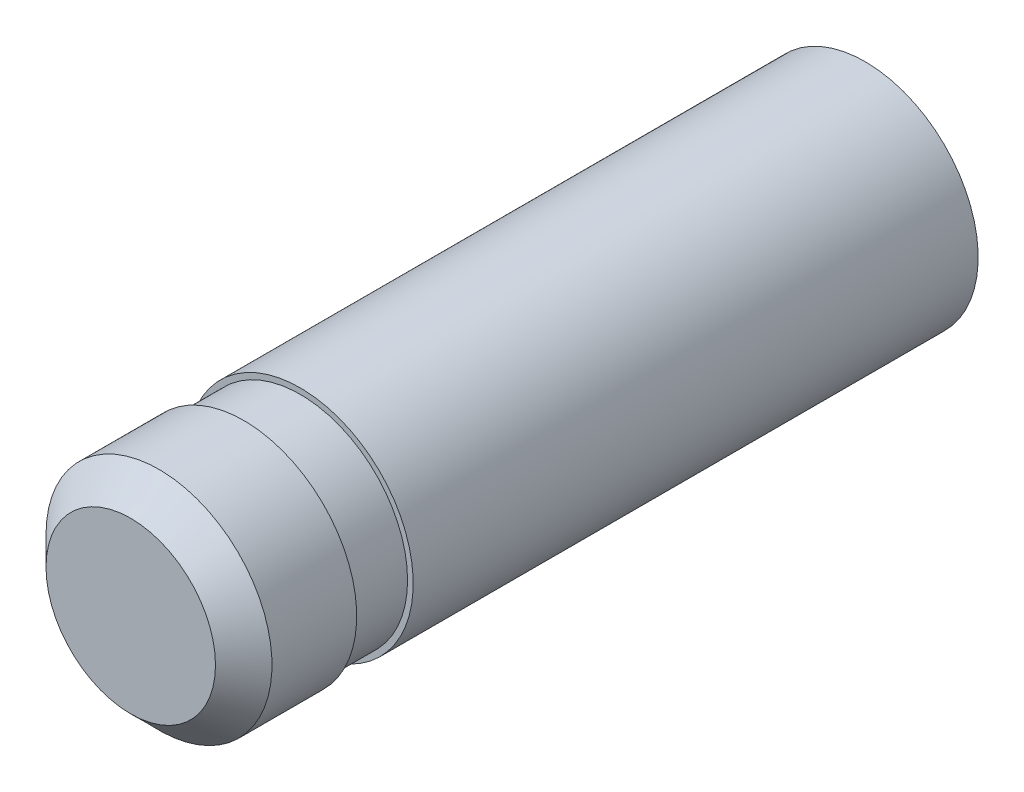
ISO-10303-21;
HEADER;
FILE_DESCRIPTION(('STEP AP214'),'2;1');
FILE_NAME('part.step','',(''),(''),'','','');
FILE_SCHEMA(('AUTOMOTIVE_DESIGN { 1 0 10303 214 1 1 1 1 }'));
ENDSEC;
DATA;
#1=APPLICATION_CONTEXT('core data for automotive mechanical design processes');
#2=APPLICATION_PROTOCOL_DEFINITION('international standard','automotive_design',2000,#1);
#3=PRODUCT_CONTEXT('',#1,'mechanical');
#4=PRODUCT('Part','Part','',(#3));
#5=PRODUCT_RELATED_PRODUCT_CATEGORY('part','',(#4));
#6=PRODUCT_DEFINITION_FORMATION('','',#4);
#7=PRODUCT_DEFINITION_CONTEXT('part definition',#1,'design');
#8=PRODUCT_DEFINITION('design','',#6,#7);
#9=PRODUCT_DEFINITION_SHAPE('','',#8);
#10=(LENGTH_UNIT() NAMED_UNIT(*) SI_UNIT(.MILLI.,.METRE.));
#11=(NAMED_UNIT(*) PLANE_ANGLE_UNIT() SI_UNIT($,.RADIAN.));
#12=(NAMED_UNIT(*) SI_UNIT($,.STERADIAN.) SOLID_ANGLE_UNIT());
#13=UNCERTAINTY_MEASURE_WITH_UNIT(LENGTH_MEASURE(1.E-05),#10,'distance_accuracy_value','');
#14=(GEOMETRIC_REPRESENTATION_CONTEXT(3) GLOBAL_UNCERTAINTY_ASSIGNED_CONTEXT((#13)) GLOBAL_UNIT_ASSIGNED_CONTEXT((#10,
#11,#12)) REPRESENTATION_CONTEXT('',''));
#15=CARTESIAN_POINT('',(0.,0.,0.));
#16=DIRECTION('',(0.,0.,1.));
#17=DIRECTION('',(1.,0.,0.));
#18=AXIS2_PLACEMENT_3D('',#15,#16,#17);
#19=CARTESIAN_POINT('',(0.,0.,6.5));
#20=DIRECTION('',(0.,0.,-1.));
#21=DIRECTION('',(-1.,0.,0.));
#22=AXIS2_PLACEMENT_3D('',#19,#20,#21);
#23=CYLINDRICAL_SURFACE('',#22,2.);
#24=CARTESIAN_POINT('',(0.,0.,-6.5));
#25=DIRECTION('',(0.,0.,1.));
#26=DIRECTION('',(1.,0.,0.));
#27=AXIS2_PLACEMENT_3D('',#24,#25,#26);
#28=CIRCLE('',#27,2.);
#29=CARTESIAN_POINT('',(-2.,0.,-6.5));
#30=VERTEX_POINT('',#29);
#31=EDGE_CURVE('E53',#30,#30,#28,.T.);
#32=CARTESIAN_POINT('',(0.,0.,3.5));
#33=DIRECTION('',(0.,0.,1.));
#34=DIRECTION('',(1.,0.,0.));
#35=AXIS2_PLACEMENT_3D('',#32,#33,#34);
#36=CIRCLE('',#35,2.);
#37=CARTESIAN_POINT('',(-2.,0.,3.5));
#38=VERTEX_POINT('',#37);
#39=EDGE_CURVE('E57',#38,#38,#36,.T.);
#40=CARTESIAN_POINT('',(-2.,0.,-6.5));
#41=CARTESIAN_POINT('',(-2.,0.,-6.39583333333333));
#42=CARTESIAN_POINT('',(-2.,0.,-6.29166666666667));
#43=CARTESIAN_POINT('',(-2.,0.,-6.08333333333333));
#44=CARTESIAN_POINT('',(-2.,0.,-5.97916666666667));
#45=CARTESIAN_POINT('',(-2.,0.,-5.77083333333333));
#46=CARTESIAN_POINT('',(-2.,0.,-5.66666666666667));
#47=CARTESIAN_POINT('',(-2.,0.,-5.45833333333333));
#48=CARTESIAN_POINT('',(-2.,0.,-5.35416666666667));
#49=CARTESIAN_POINT('',(-2.,0.,-5.14583333333333));
#50=CARTESIAN_POINT('',(-2.,0.,-5.04166666666667));
#51=CARTESIAN_POINT('',(-2.,0.,-4.83333333333333));
#52=CARTESIAN_POINT('',(-2.,0.,-4.72916666666667));
#53=CARTESIAN_POINT('',(-2.,0.,-4.52083333333333));
#54=CARTESIAN_POINT('',(-2.,0.,-4.41666666666667));
#55=CARTESIAN_POINT('',(-2.,0.,-4.20833333333333));
#56=CARTESIAN_POINT('',(-2.,0.,-4.10416666666667));
#57=CARTESIAN_POINT('',(-2.,0.,-3.89583333333333));
#58=CARTESIAN_POINT('',(-2.,0.,-3.79166666666667));
#59=CARTESIAN_POINT('',(-2.,0.,-3.58333333333333));
#60=CARTESIAN_POINT('',(-2.,0.,-3.47916666666667));
#61=CARTESIAN_POINT('',(-2.,0.,-3.27083333333333));
#62=CARTESIAN_POINT('',(-2.,0.,-3.16666666666667));
#63=CARTESIAN_POINT('',(-2.,0.,-2.95833333333333));
#64=CARTESIAN_POINT('',(-2.,0.,-2.85416666666667));
#65=CARTESIAN_POINT('',(-2.,0.,-2.64583333333333));
#66=CARTESIAN_POINT('',(-2.,0.,-2.54166666666667));
#67=CARTESIAN_POINT('',(-2.,0.,-2.33333333333333));
#68=CARTESIAN_POINT('',(-2.,0.,-2.22916666666667));
#69=CARTESIAN_POINT('',(-2.,0.,-2.02083333333333));
#70=CARTESIAN_POINT('',(-2.,0.,-1.91666666666667));
#71=CARTESIAN_POINT('',(-2.,0.,-1.70833333333333));
#72=CARTESIAN_POINT('',(-2.,0.,-1.60416666666667));
#73=CARTESIAN_POINT('',(-2.,0.,-1.39583333333333));
#74=CARTESIAN_POINT('',(-2.,0.,-1.29166666666667));
#75=CARTESIAN_POINT('',(-2.,0.,-1.08333333333333));
#76=CARTESIAN_POINT('',(-2.,0.,-0.979166666666667));
#77=CARTESIAN_POINT('',(-2.,0.,-0.770833333333334));
#78=CARTESIAN_POINT('',(-2.,0.,-0.666666666666667));
#79=CARTESIAN_POINT('',(-2.,0.,-0.458333333333334));
#80=CARTESIAN_POINT('',(-2.,0.,-0.354166666666667));
#81=CARTESIAN_POINT('',(-2.,0.,-0.145833333333334));
#82=CARTESIAN_POINT('',(-2.,0.,-0.0416666666666673));
#83=CARTESIAN_POINT('',(-2.,0.,0.166666666666666));
#84=CARTESIAN_POINT('',(-2.,0.,0.270833333333333));
#85=CARTESIAN_POINT('',(-2.,0.,0.479166666666666));
#86=CARTESIAN_POINT('',(-2.,0.,0.583333333333333));
#87=CARTESIAN_POINT('',(-2.,0.,0.791666666666666));
#88=CARTESIAN_POINT('',(-2.,0.,0.895833333333333));
#89=CARTESIAN_POINT('',(-2.,0.,1.10416666666667));
#90=CARTESIAN_POINT('',(-2.,0.,1.20833333333333));
#91=CARTESIAN_POINT('',(-2.,0.,1.41666666666667));
#92=CARTESIAN_POINT('',(-2.,0.,1.52083333333333));
#93=CARTESIAN_POINT('',(-2.,0.,1.72916666666667));
#94=CARTESIAN_POINT('',(-2.,0.,1.83333333333333));
#95=CARTESIAN_POINT('',(-2.,0.,2.04166666666667));
#96=CARTESIAN_POINT('',(-2.,0.,2.14583333333333));
#97=CARTESIAN_POINT('',(-2.,0.,2.35416666666667));
#98=CARTESIAN_POINT('',(-2.,0.,2.45833333333333));
#99=CARTESIAN_POINT('',(-2.,0.,2.66666666666667));
#100=CARTESIAN_POINT('',(-2.,0.,2.77083333333333));
#101=CARTESIAN_POINT('',(-2.,0.,2.97916666666667));
#102=CARTESIAN_POINT('',(-2.,0.,3.08333333333333));
#103=CARTESIAN_POINT('',(-2.,0.,3.29166666666667));
#104=CARTESIAN_POINT('',(-2.,0.,3.39583333333333));
#105=CARTESIAN_POINT('',(-2.,0.,3.5));
#106=B_SPLINE_CURVE_WITH_KNOTS('',3,(#40,#41,#42,#43,#44,#45,#46,#47,#48,#49,#50,#51,#52,#53,
#54,#55,#56,#57,#58,#59,#60,#61,#62,#63,#64,#65,#66,#67,#68,#69,#70,#71,#72,#73,#74,#75,#76,#77,
#78,#79,#80,#81,#82,#83,#84,#85,#86,#87,#88,#89,#90,#91,#92,#93,#94,#95,#96,#97,#98,#99,#100,
#101,#102,#103,#104,#105),.UNSPECIFIED.,.F.,.F.,(4,2,2,2,2,2,2,2,2,2,2,2,2,2,2,2,2,2,2,2,2,2,2,
2,2,2,2,2,2,2,2,2,4),(0.,0.3125,0.625000000000001,0.937500000000001,1.25,1.5625,1.875,2.1875,
2.5,2.8125,3.125,3.4375,3.75,4.0625,4.375,4.6875,5.,5.3125,5.625,5.9375,6.25,6.5625,6.875,
7.1875,7.5,7.8125,8.125,8.4375,8.75,9.0625,9.375,9.6875,10.),.UNSPECIFIED.);
#107=EDGE_CURVE('BSEAM41',#30,#38,#106,.T.);
#108=ORIENTED_EDGE('',*,*,#31,.T.);
#109=ORIENTED_EDGE('',*,*,#39,.F.);
#110=ORIENTED_EDGE('',*,*,#107,.T.);
#111=ORIENTED_EDGE('',*,*,#107,.F.);
#112=EDGE_LOOP('',(#108,#110,#109,#111));
#113=FACE_BOUND('',#112,.T.);
#114=ADVANCED_FACE('F41',(#113),#23,.T.);
#115=CARTESIAN_POINT('',(0.,0.,-6.5));
#116=DIRECTION('',(0.,0.,1.));
#117=DIRECTION('',(1.,0.,0.));
#118=AXIS2_PLACEMENT_3D('',#115,#116,#117);
#119=PLANE('',#118);
#120=ORIENTED_EDGE('',*,*,#31,.F.);
#121=EDGE_LOOP('',(#120));
#122=FACE_BOUND('',#121,.T.);
#123=ADVANCED_FACE('F79',(#122),#119,.F.);
#124=CARTESIAN_POINT('',(0.,0.,3.5));
#125=DIRECTION('',(0.,0.,1.));
#126=DIRECTION('',(1.,0.,0.));
#127=AXIS2_PLACEMENT_3D('',#124,#125,#126);
#128=PLANE('',#127);
#129=CARTESIAN_POINT('',(0.,0.,3.5));
#130=DIRECTION('',(0.,0.,1.));
#131=DIRECTION('',(1.,0.,0.));
#132=AXIS2_PLACEMENT_3D('',#129,#130,#131);
#133=CIRCLE('',#132,1.9);
#134=CARTESIAN_POINT('',(1.9,0.,3.5));
#135=VERTEX_POINT('',#134);
#136=EDGE_CURVE('E63',#135,#135,#133,.T.);
#137=ORIENTED_EDGE('',*,*,#136,.F.);
#138=EDGE_LOOP('',(#137));
#139=FACE_BOUND('',#138,.T.);
#140=ORIENTED_EDGE('',*,*,#39,.T.);
#141=EDGE_LOOP('',(#140));
#142=FACE_BOUND('',#141,.T.);
#143=ADVANCED_FACE('F75',(#139,#142),#128,.T.);
#144=CARTESIAN_POINT('',(0.,0.,4.5));
#145=DIRECTION('',(0.,0.,1.));
#146=DIRECTION('',(1.,0.,0.));
#147=AXIS2_PLACEMENT_3D('',#144,#145,#146);
#148=PLANE('',#147);
#149=CARTESIAN_POINT('',(0.,0.,4.5));
#150=DIRECTION('',(0.,0.,1.));
#151=DIRECTION('',(1.,0.,0.));
#152=AXIS2_PLACEMENT_3D('',#149,#150,#151);
#153=CIRCLE('',#152,1.9);
#154=CARTESIAN_POINT('',(1.9,0.,4.5));
#155=VERTEX_POINT('',#154);
#156=EDGE_CURVE('E66',#155,#155,#153,.T.);
#157=ORIENTED_EDGE('',*,*,#156,.T.);
#158=EDGE_LOOP('',(#157));
#159=FACE_BOUND('',#158,.T.);
#160=CARTESIAN_POINT('',(0.,0.,4.5));
#161=DIRECTION('',(0.,0.,1.));
#162=DIRECTION('',(1.,0.,0.));
#163=AXIS2_PLACEMENT_3D('',#160,#161,#162);
#164=CIRCLE('',#163,2.);
#165=CARTESIAN_POINT('',(-2.,0.,4.5));
#166=VERTEX_POINT('',#165);
#167=EDGE_CURVE('E60',#166,#166,#164,.T.);
#168=ORIENTED_EDGE('',*,*,#167,.F.);
#169=EDGE_LOOP('',(#168));
#170=FACE_BOUND('',#169,.T.);
#171=ADVANCED_FACE('F78',(#159,#170),#148,.F.);
#172=CARTESIAN_POINT('',(0.,0.,3.5));
#173=DIRECTION('',(0.,0.,1.));
#174=DIRECTION('',(1.,0.,0.));
#175=AXIS2_PLACEMENT_3D('',#172,#173,#174);
#176=CYLINDRICAL_SURFACE('',#175,1.9);
#177=ORIENTED_EDGE('',*,*,#136,.T.);
#178=EDGE_LOOP('',(#177));
#179=FACE_BOUND('',#178,.T.);
#180=ORIENTED_EDGE('',*,*,#156,.F.);
#181=EDGE_LOOP('',(#180));
#182=FACE_BOUND('',#181,.T.);
#183=ADVANCED_FACE('F72',(#179,#182),#176,.T.);
#184=CARTESIAN_POINT('',(0.,0.,6.5));
#185=DIRECTION('',(0.,0.,1.));
#186=DIRECTION('',(1.,0.,0.));
#187=AXIS2_PLACEMENT_3D('',#184,#185,#186);
#188=PLANE('',#187);
#189=CARTESIAN_POINT('',(0.,0.,6.5));
#190=DIRECTION('',(0.,0.,1.));
#191=DIRECTION('',(1.,0.,0.));
#192=AXIS2_PLACEMENT_3D('',#189,#190,#191);
#193=CIRCLE('',#192,1.50000000000001);
#194=CARTESIAN_POINT('',(1.50000000000001,0.,6.5));
#195=VERTEX_POINT('',#194);
#196=EDGE_CURVE('E49',#195,#195,#193,.T.);
#197=ORIENTED_EDGE('',*,*,#196,.T.);
#198=EDGE_LOOP('',(#197));
#199=FACE_BOUND('',#198,.T.);
#200=ADVANCED_FACE('F92',(#199),#188,.T.);
#201=CARTESIAN_POINT('',(0.,0.,6.00000000000001));
#202=DIRECTION('',(0.,0.,1.));
#203=DIRECTION('',(1.,0.,0.));
#204=AXIS2_PLACEMENT_3D('',#201,#202,#203);
#205=CIRCLE('',#204,2.);
#206=CARTESIAN_POINT('',(-2.,0.,6.00000000000001));
#207=VERTEX_POINT('',#206);
#208=EDGE_CURVE('E10',#207,#207,#205,.F.);
#209=CARTESIAN_POINT('',(-2.,0.,6.00000000000001));
#210=CARTESIAN_POINT('',(-2.,0.,5.98437500000001));
#211=CARTESIAN_POINT('',(-2.,0.,5.96875000000001));
#212=CARTESIAN_POINT('',(-2.,0.,5.93750000000001));
#213=CARTESIAN_POINT('',(-2.,0.,5.92187500000001));
#214=CARTESIAN_POINT('',(-2.,0.,5.89062500000001));
#215=CARTESIAN_POINT('',(-2.,0.,5.87500000000001));
#216=CARTESIAN_POINT('',(-2.,0.,5.84375000000001));
#217=CARTESIAN_POINT('',(-2.,0.,5.82812500000001));
#218=CARTESIAN_POINT('',(-2.,0.,5.79687500000001));
#219=CARTESIAN_POINT('',(-2.,0.,5.78125000000001));
#220=CARTESIAN_POINT('',(-2.,0.,5.75000000000001));
#221=CARTESIAN_POINT('',(-2.,0.,5.734375));
#222=CARTESIAN_POINT('',(-2.,0.,5.703125));
#223=CARTESIAN_POINT('',(-2.,0.,5.6875));
#224=CARTESIAN_POINT('',(-2.,0.,5.65625));
#225=CARTESIAN_POINT('',(-2.,0.,5.640625));
#226=CARTESIAN_POINT('',(-2.,0.,5.609375));
#227=CARTESIAN_POINT('',(-2.,0.,5.59375));
#228=CARTESIAN_POINT('',(-2.,0.,5.5625));
#229=CARTESIAN_POINT('',(-2.,0.,5.546875));
#230=CARTESIAN_POINT('',(-2.,0.,5.515625));
#231=CARTESIAN_POINT('',(-2.,0.,5.5));
#232=CARTESIAN_POINT('',(-2.,0.,5.46875));
#233=CARTESIAN_POINT('',(-2.,0.,5.453125));
#234=CARTESIAN_POINT('',(-2.,0.,5.421875));
#235=CARTESIAN_POINT('',(-2.,0.,5.40625));
#236=CARTESIAN_POINT('',(-2.,0.,5.375));
#237=CARTESIAN_POINT('',(-2.,0.,5.359375));
#238=CARTESIAN_POINT('',(-2.,0.,5.328125));
#239=CARTESIAN_POINT('',(-2.,0.,5.3125));
#240=CARTESIAN_POINT('',(-2.,0.,5.28125));
#241=CARTESIAN_POINT('',(-2.,0.,5.265625));
#242=CARTESIAN_POINT('',(-2.,0.,5.234375));
#243=CARTESIAN_POINT('',(-2.,0.,5.21875));
#244=CARTESIAN_POINT('',(-2.,0.,5.1875));
#245=CARTESIAN_POINT('',(-2.,0.,5.171875));
#246=CARTESIAN_POINT('',(-2.,0.,5.140625));
#247=CARTESIAN_POINT('',(-2.,0.,5.125));
#248=CARTESIAN_POINT('',(-2.,0.,5.09375));
#249=CARTESIAN_POINT('',(-2.,0.,5.078125));
#250=CARTESIAN_POINT('',(-2.,0.,5.046875));
#251=CARTESIAN_POINT('',(-2.,0.,5.03125));
#252=CARTESIAN_POINT('',(-2.,0.,5.));
#253=CARTESIAN_POINT('',(-2.,0.,4.984375));
#254=CARTESIAN_POINT('',(-2.,0.,4.953125));
#255=CARTESIAN_POINT('',(-2.,0.,4.9375));
#256=CARTESIAN_POINT('',(-2.,0.,4.90625));
#257=CARTESIAN_POINT('',(-2.,0.,4.890625));
#258=CARTESIAN_POINT('',(-2.,0.,4.859375));
#259=CARTESIAN_POINT('',(-2.,0.,4.84375));
#260=CARTESIAN_POINT('',(-2.,0.,4.8125));
#261=CARTESIAN_POINT('',(-2.,0.,4.796875));
#262=CARTESIAN_POINT('',(-2.,0.,4.765625));
#263=CARTESIAN_POINT('',(-2.,0.,4.75));
#264=CARTESIAN_POINT('',(-2.,0.,4.71875));
#265=CARTESIAN_POINT('',(-2.,0.,4.703125));
#266=CARTESIAN_POINT('',(-2.,0.,4.671875));
#267=CARTESIAN_POINT('',(-2.,0.,4.65625));
#268=CARTESIAN_POINT('',(-2.,0.,4.625));
#269=CARTESIAN_POINT('',(-2.,0.,4.609375));
#270=CARTESIAN_POINT('',(-2.,0.,4.578125));
#271=CARTESIAN_POINT('',(-2.,0.,4.5625));
#272=CARTESIAN_POINT('',(-2.,0.,4.53125));
#273=CARTESIAN_POINT('',(-2.,0.,4.515625));
#274=CARTESIAN_POINT('',(-2.,0.,4.5));
#275=B_SPLINE_CURVE_WITH_KNOTS('',3,(#209,#210,#211,#212,#213,#214,#215,#216,#217,#218,#219,
#220,#221,#222,#223,#224,#225,#226,#227,#228,#229,#230,#231,#232,#233,#234,#235,#236,#237,#238,
#239,#240,#241,#242,#243,#244,#245,#246,#247,#248,#249,#250,#251,#252,#253,#254,#255,#256,#257,
#258,#259,#260,#261,#262,#263,#264,#265,#266,#267,#268,#269,#270,#271,#272,#273,#274),
.UNSPECIFIED.,.F.,.F.,(4,2,2,2,2,2,2,2,2,2,2,2,2,2,2,2,2,2,2,2,2,2,2,2,2,2,2,2,2,2,2,2,4),(0.,
0.0468750000000009,0.0937500000000009,0.140625000000001,0.187500000000001,0.234375000000001,
0.281250000000002,0.328125000000002,0.375000000000002,0.421875000000002,0.468750000000002,
0.515625000000003,0.562500000000003,0.609375000000003,0.656250000000003,0.703125000000003,
0.750000000000003,0.796875000000004,0.843750000000004,0.890625000000004,0.937500000000004,
0.984375000000005,1.03125000000001,1.07812500000001,1.12500000000001,1.17187500000001,
1.21875000000001,1.26562500000001,1.31250000000001,1.35937500000001,1.40625000000001,
1.45312500000001,1.50000000000001),.UNSPECIFIED.);
#276=EDGE_CURVE('BSEAM85',#207,#166,#275,.T.);
#277=ORIENTED_EDGE('',*,*,#208,.T.);
#278=ORIENTED_EDGE('',*,*,#167,.T.);
#279=ORIENTED_EDGE('',*,*,#276,.T.);
#280=ORIENTED_EDGE('',*,*,#276,.F.);
#281=EDGE_LOOP('',(#277,#279,#278,#280));
#282=FACE_BOUND('',#281,.T.);
#283=ADVANCED_FACE('F85',(#282),#23,.T.);
#284=CARTESIAN_POINT('',(0.,0.,6.5));
#285=DIRECTION('',(0.,0.,-1.));
#286=DIRECTION('',(-1.,0.,0.));
#287=AXIS2_PLACEMENT_3D('',#284,#285,#286);
#288=CONICAL_SURFACE('',#287,1.50000000000001,0.785398163397447);
#289=ORIENTED_EDGE('',*,*,#208,.F.);
#290=EDGE_LOOP('',(#289));
#291=FACE_BOUND('',#290,.T.);
#292=ORIENTED_EDGE('',*,*,#196,.F.);
#293=EDGE_LOOP('',(#292));
#294=FACE_BOUND('',#293,.T.);
#295=ADVANCED_FACE('F44',(#291,#294),#288,.T.);
#296=CLOSED_SHELL('',(#114,#123,#143,#171,#183,#200,#283,#295));
#297=MANIFOLD_SOLID_BREP('B2',#296);
#298=ADVANCED_BREP_SHAPE_REPRESENTATION('',(#18,#297),#14);
#299=SHAPE_DEFINITION_REPRESENTATION(#9,#298);
ENDSEC;
END-ISO-10303-21;
